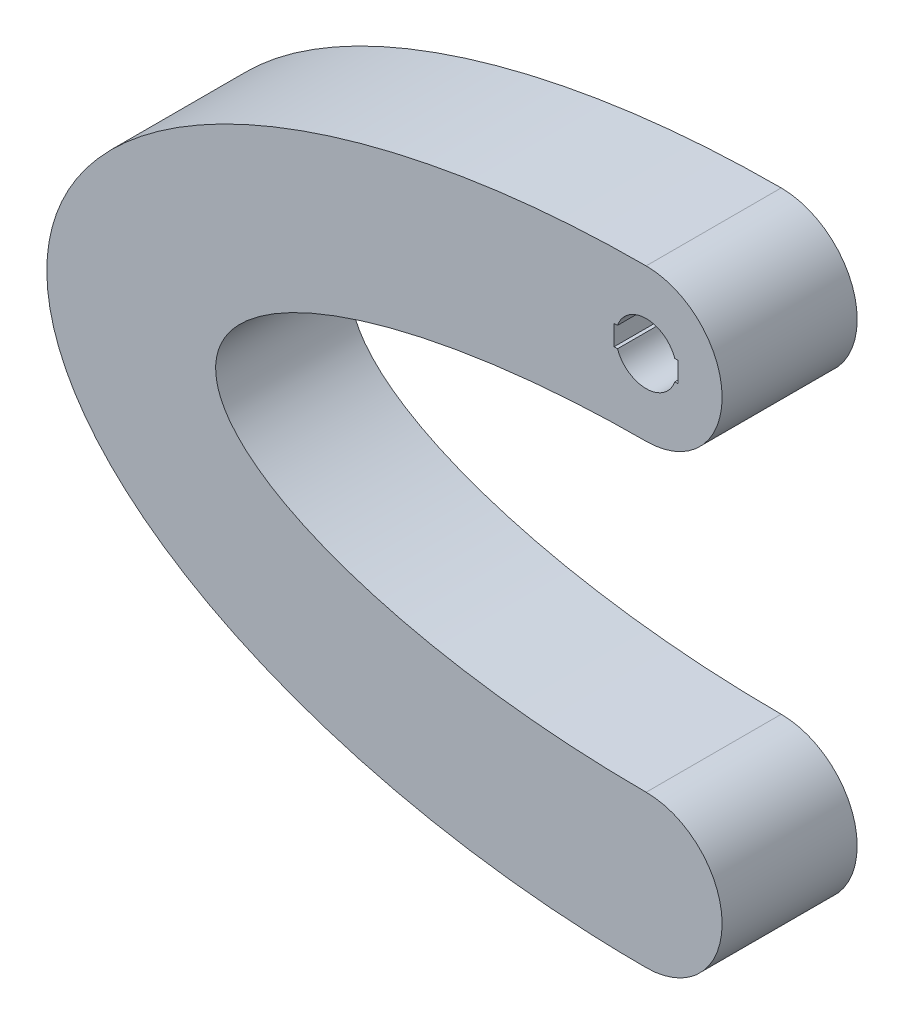
ISO-10303-21;
HEADER;
FILE_DESCRIPTION(('STEP AP214'),'2;1');
FILE_NAME('part.step','',(''),(''),'','','');
FILE_SCHEMA(('AUTOMOTIVE_DESIGN { 1 0 10303 214 1 1 1 1 }'));
ENDSEC;
DATA;
#1=APPLICATION_CONTEXT('core data for automotive mechanical design processes');
#2=APPLICATION_PROTOCOL_DEFINITION('international standard','automotive_design',2000,#1);
#3=PRODUCT_CONTEXT('',#1,'mechanical');
#4=PRODUCT('Part','Part','',(#3));
#5=PRODUCT_RELATED_PRODUCT_CATEGORY('part','',(#4));
#6=PRODUCT_DEFINITION_FORMATION('','',#4);
#7=PRODUCT_DEFINITION_CONTEXT('part definition',#1,'design');
#8=PRODUCT_DEFINITION('design','',#6,#7);
#9=PRODUCT_DEFINITION_SHAPE('','',#8);
#10=(LENGTH_UNIT() NAMED_UNIT(*) SI_UNIT(.MILLI.,.METRE.));
#11=(NAMED_UNIT(*) PLANE_ANGLE_UNIT() SI_UNIT($,.RADIAN.));
#12=(NAMED_UNIT(*) SI_UNIT($,.STERADIAN.) SOLID_ANGLE_UNIT());
#13=UNCERTAINTY_MEASURE_WITH_UNIT(LENGTH_MEASURE(1.E-05),#10,'distance_accuracy_value','');
#14=(GEOMETRIC_REPRESENTATION_CONTEXT(3) GLOBAL_UNCERTAINTY_ASSIGNED_CONTEXT((#13)) GLOBAL_UNIT_ASSIGNED_CONTEXT((#10,
#11,#12)) REPRESENTATION_CONTEXT('',''));
#15=CARTESIAN_POINT('',(0.,0.,0.));
#16=DIRECTION('',(0.,0.,1.));
#17=DIRECTION('',(1.,0.,0.));
#18=AXIS2_PLACEMENT_3D('',#15,#16,#17);
#19=CARTESIAN_POINT('',(19.375,0.,10.));
#20=DIRECTION('',(0.,0.,-1.));
#21=DIRECTION('',(-1.,0.,0.));
#22=AXIS2_PLACEMENT_3D('',#19,#20,#21);
#23=PLANE('',#22);
#24=CARTESIAN_POINT('',(19.375,0.,10.));
#25=DIRECTION('',(0.,0.,1.));
#26=DIRECTION('',(-1.,0.,0.));
#27=AXIS2_PLACEMENT_3D('',#24,#25,#26);
#28=ELLIPSE('',#27,44.375,22.5);
#29=CARTESIAN_POINT('',(19.375,22.5,10.));
#30=VERTEX_POINT('',#29);
#31=CARTESIAN_POINT('',(19.375,-22.5,10.));
#32=VERTEX_POINT('',#31);
#33=EDGE_CURVE('E348',#30,#32,#28,.T.);
#34=ORIENTED_EDGE('',*,*,#33,.T.);
#35=CARTESIAN_POINT('',(19.375,-16.875,10.));
#36=DIRECTION('',(0.,0.,1.));
#37=DIRECTION('',(1.,0.,0.));
#38=AXIS2_PLACEMENT_3D('',#35,#36,#37);
#39=CIRCLE('',#38,5.625);
#40=CARTESIAN_POINT('',(19.375,-11.25,10.));
#41=VERTEX_POINT('',#40);
#42=EDGE_CURVE('E96',#32,#41,#39,.T.);
#43=ORIENTED_EDGE('',*,*,#42,.T.);
#44=CARTESIAN_POINT('',(19.375,0.,10.));
#45=DIRECTION('',(0.,0.,-1.));
#46=DIRECTION('',(-1.,0.,0.));
#47=AXIS2_PLACEMENT_3D('',#44,#45,#46);
#48=ELLIPSE('',#47,31.875,11.25);
#49=CARTESIAN_POINT('',(19.375,11.25,10.));
#50=VERTEX_POINT('',#49);
#51=EDGE_CURVE('E354',#41,#50,#48,.T.);
#52=ORIENTED_EDGE('',*,*,#51,.T.);
#53=CARTESIAN_POINT('',(19.375,16.875,10.));
#54=DIRECTION('',(0.,0.,1.));
#55=DIRECTION('',(-1.,0.,0.));
#56=AXIS2_PLACEMENT_3D('',#53,#54,#55);
#57=CIRCLE('',#56,5.625);
#58=EDGE_CURVE('E67',#50,#30,#57,.T.);
#59=ORIENTED_EDGE('',*,*,#58,.T.);
#60=EDGE_LOOP('',(#34,#43,#52,#59));
#61=FACE_BOUND('',#60,.T.);
#62=DIRECTION('',(1.,0.,0.));
#63=VECTOR('',#62,1.);
#64=CARTESIAN_POINT('',(17.25,16.125,10.));
#65=LINE('',#64,#63);
#66=CARTESIAN_POINT('',(21.4963203435596,16.125,10.));
#67=VERTEX_POINT('',#66);
#68=CARTESIAN_POINT('',(21.75,16.125,10.));
#69=VERTEX_POINT('',#68);
#70=EDGE_CURVE('E321',#67,#69,#65,.T.);
#71=ORIENTED_EDGE('',*,*,#70,.F.);
#72=CARTESIAN_POINT('',(19.375,16.875,10.));
#73=DIRECTION('',(0.,0.,1.));
#74=DIRECTION('',(1.,0.,0.));
#75=AXIS2_PLACEMENT_3D('',#72,#73,#74);
#76=CIRCLE('',#75,2.25);
#77=CARTESIAN_POINT('',(17.2536796564404,16.125,10.));
#78=VERTEX_POINT('',#77);
#79=EDGE_CURVE('E253',#78,#67,#76,.T.);
#80=ORIENTED_EDGE('',*,*,#79,.F.);
#81=CARTESIAN_POINT('',(17.,16.125,10.));
#82=VERTEX_POINT('',#81);
#83=EDGE_CURVE('E340',#82,#78,#65,.T.);
#84=ORIENTED_EDGE('',*,*,#83,.F.);
#85=DIRECTION('',(0.,1.,0.));
#86=VECTOR('',#85,1.);
#87=CARTESIAN_POINT('',(17.,0.,10.));
#88=LINE('',#87,#86);
#89=CARTESIAN_POINT('',(17.,17.625,10.));
#90=VERTEX_POINT('',#89);
#91=EDGE_CURVE('E218',#82,#90,#88,.T.);
#92=ORIENTED_EDGE('',*,*,#91,.T.);
#93=DIRECTION('',(1.,0.,0.));
#94=VECTOR('',#93,1.);
#95=CARTESIAN_POINT('',(17.25,17.625,10.));
#96=LINE('',#95,#94);
#97=CARTESIAN_POINT('',(17.2536796564403,17.625,10.));
#98=VERTEX_POINT('',#97);
#99=EDGE_CURVE('E345',#90,#98,#96,.T.);
#100=ORIENTED_EDGE('',*,*,#99,.T.);
#101=CARTESIAN_POINT('',(19.375,16.875,10.));
#102=DIRECTION('',(0.,0.,1.));
#103=DIRECTION('',(1.,0.,0.));
#104=AXIS2_PLACEMENT_3D('',#101,#102,#103);
#105=CIRCLE('',#104,2.25);
#106=CARTESIAN_POINT('',(21.4963203435596,17.625,10.));
#107=VERTEX_POINT('',#106);
#108=EDGE_CURVE('E222',#107,#98,#105,.T.);
#109=ORIENTED_EDGE('',*,*,#108,.F.);
#110=CARTESIAN_POINT('',(21.75,17.625,10.));
#111=VERTEX_POINT('',#110);
#112=EDGE_CURVE('E344',#107,#111,#96,.T.);
#113=ORIENTED_EDGE('',*,*,#112,.T.);
#114=DIRECTION('',(0.,1.,0.));
#115=VECTOR('',#114,1.);
#116=CARTESIAN_POINT('',(21.75,0.,10.));
#117=LINE('',#116,#115);
#118=EDGE_CURVE('E256',#69,#111,#117,.T.);
#119=ORIENTED_EDGE('',*,*,#118,.F.);
#120=EDGE_LOOP('',(#71,#80,#84,#92,#100,#109,#113,#119));
#121=FACE_BOUND('',#120,.T.);
#122=ADVANCED_FACE('F41',(#61,#121),#23,.F.);
#123=CARTESIAN_POINT('',(0.,0.,2.));
#124=DIRECTION('',(0.,0.,1.));
#125=DIRECTION('',(1.,0.,0.));
#126=AXIS2_PLACEMENT_3D('',#123,#124,#125);
#127=PLANE('',#126);
#128=CARTESIAN_POINT('',(19.375,16.875,2.));
#129=DIRECTION('',(0.,0.,1.));
#130=DIRECTION('',(1.,0.,0.));
#131=AXIS2_PLACEMENT_3D('',#128,#129,#130);
#132=CIRCLE('',#131,2.25);
#133=CARTESIAN_POINT('',(17.25,16.1354900271125,2.));
#134=VERTEX_POINT('',#133);
#135=CARTESIAN_POINT('',(17.2536796564404,16.125,2.));
#136=VERTEX_POINT('',#135);
#137=EDGE_CURVE('E265',#134,#136,#132,.T.);
#138=ORIENTED_EDGE('',*,*,#137,.F.);
#139=DIRECTION('',(0.,1.,0.));
#140=VECTOR('',#139,1.);
#141=CARTESIAN_POINT('',(17.25,16.125,2.));
#142=LINE('',#141,#140);
#143=CARTESIAN_POINT('',(17.25,16.125,2.));
#144=VERTEX_POINT('',#143);
#145=EDGE_CURVE('E336',#144,#134,#142,.T.);
#146=ORIENTED_EDGE('',*,*,#145,.F.);
#147=DIRECTION('',(1.,0.,0.));
#148=VECTOR('',#147,1.);
#149=CARTESIAN_POINT('',(17.25,16.125,2.));
#150=LINE('',#149,#148);
#151=EDGE_CURVE('E322',#144,#136,#150,.T.);
#152=ORIENTED_EDGE('',*,*,#151,.T.);
#153=EDGE_LOOP('',(#138,#146,#152));
#154=FACE_BOUND('',#153,.T.);
#155=ADVANCED_FACE('F374',(#154),#127,.T.);
#156=CARTESIAN_POINT('',(21.4963203435596,16.125,2.));
#157=VERTEX_POINT('',#156);
#158=CARTESIAN_POINT('',(21.5,16.1354900271126,2.));
#159=VERTEX_POINT('',#158);
#160=EDGE_CURVE('E199',#157,#159,#132,.T.);
#161=ORIENTED_EDGE('',*,*,#160,.F.);
#162=CARTESIAN_POINT('',(21.5,16.125,2.));
#163=VERTEX_POINT('',#162);
#164=EDGE_CURVE('E327',#157,#163,#150,.T.);
#165=ORIENTED_EDGE('',*,*,#164,.T.);
#166=DIRECTION('',(0.,1.,0.));
#167=VECTOR('',#166,1.);
#168=CARTESIAN_POINT('',(21.5,16.125,2.));
#169=LINE('',#168,#167);
#170=EDGE_CURVE('E328',#163,#159,#169,.T.);
#171=ORIENTED_EDGE('',*,*,#170,.T.);
#172=EDGE_LOOP('',(#161,#165,#171));
#173=FACE_BOUND('',#172,.T.);
#174=ADVANCED_FACE('F380',(#173),#127,.T.);
#175=CARTESIAN_POINT('',(19.375,16.875,2.));
#176=DIRECTION('',(0.,0.,1.));
#177=DIRECTION('',(1.,0.,0.));
#178=AXIS2_PLACEMENT_3D('',#175,#176,#177);
#179=CIRCLE('',#178,2.25);
#180=CARTESIAN_POINT('',(21.5,17.6145099728874,2.));
#181=VERTEX_POINT('',#180);
#182=CARTESIAN_POINT('',(21.4963203435596,17.625,2.));
#183=VERTEX_POINT('',#182);
#184=EDGE_CURVE('E311',#181,#183,#179,.T.);
#185=ORIENTED_EDGE('',*,*,#184,.F.);
#186=CARTESIAN_POINT('',(21.5,17.625,2.));
#187=VERTEX_POINT('',#186);
#188=EDGE_CURVE('E326',#181,#187,#169,.T.);
#189=ORIENTED_EDGE('',*,*,#188,.T.);
#190=DIRECTION('',(1.,0.,0.));
#191=VECTOR('',#190,1.);
#192=CARTESIAN_POINT('',(17.25,17.625,2.));
#193=LINE('',#192,#191);
#194=EDGE_CURVE('E331',#183,#187,#193,.T.);
#195=ORIENTED_EDGE('',*,*,#194,.F.);
#196=EDGE_LOOP('',(#185,#189,#195));
#197=FACE_BOUND('',#196,.T.);
#198=ADVANCED_FACE('F371',(#197),#127,.T.);
#199=DIRECTION('',(0.,0.,-1.));
#200=VECTOR('',#199,1.);
#201=SURFACE_OF_LINEAR_EXTRUSION('',#28,#200);
#202=CARTESIAN_POINT('',(19.375,0.,0.));
#203=DIRECTION('',(0.,0.,1.));
#204=DIRECTION('',(-1.,0.,0.));
#205=AXIS2_PLACEMENT_3D('',#202,#203,#204);
#206=ELLIPSE('',#205,44.375,22.5);
#207=CARTESIAN_POINT('',(19.375,22.5,0.));
#208=VERTEX_POINT('',#207);
#209=CARTESIAN_POINT('',(19.375,-22.5,0.));
#210=VERTEX_POINT('',#209);
#211=EDGE_CURVE('E339',#208,#210,#206,.T.);
#212=ORIENTED_EDGE('',*,*,#211,.T.);
#213=DIRECTION('',(0.,0.,-1.));
#214=VECTOR('',#213,1.);
#215=CARTESIAN_POINT('',(19.375,-22.5,10.));
#216=LINE('',#215,#214);
#217=EDGE_CURVE('E51',#32,#210,#216,.T.);
#218=ORIENTED_EDGE('',*,*,#217,.F.);
#219=ORIENTED_EDGE('',*,*,#33,.F.);
#220=DIRECTION('',(0.,0.,-1.));
#221=VECTOR('',#220,1.);
#222=CARTESIAN_POINT('',(19.375,22.5,10.));
#223=LINE('',#222,#221);
#224=EDGE_CURVE('E616',#30,#208,#223,.T.);
#225=ORIENTED_EDGE('',*,*,#224,.T.);
#226=EDGE_LOOP('',(#212,#218,#219,#225));
#227=FACE_BOUND('',#226,.T.);
#228=ADVANCED_FACE('F43',(#227),#201,.F.);
#229=CARTESIAN_POINT('',(19.375,-16.875,10.));
#230=DIRECTION('',(0.,0.,-1.));
#231=DIRECTION('',(-1.,0.,0.));
#232=AXIS2_PLACEMENT_3D('',#229,#230,#231);
#233=CYLINDRICAL_SURFACE('',#232,5.625);
#234=CARTESIAN_POINT('',(19.375,-16.875,0.));
#235=DIRECTION('',(0.,0.,1.));
#236=DIRECTION('',(1.,0.,0.));
#237=AXIS2_PLACEMENT_3D('',#234,#235,#236);
#238=CIRCLE('',#237,5.625);
#239=CARTESIAN_POINT('',(19.375,-11.25,0.));
#240=VERTEX_POINT('',#239);
#241=EDGE_CURVE('E607',#210,#240,#238,.T.);
#242=ORIENTED_EDGE('',*,*,#241,.T.);
#243=DIRECTION('',(0.,0.,-1.));
#244=VECTOR('',#243,1.);
#245=CARTESIAN_POINT('',(19.375,-11.25,10.));
#246=LINE('',#245,#244);
#247=EDGE_CURVE('E621',#41,#240,#246,.T.);
#248=ORIENTED_EDGE('',*,*,#247,.F.);
#249=ORIENTED_EDGE('',*,*,#42,.F.);
#250=ORIENTED_EDGE('',*,*,#217,.T.);
#251=EDGE_LOOP('',(#242,#248,#249,#250));
#252=FACE_BOUND('',#251,.T.);
#253=ADVANCED_FACE('F364',(#252),#233,.T.);
#254=DIRECTION('',(0.,0.,-1.));
#255=VECTOR('',#254,1.);
#256=SURFACE_OF_LINEAR_EXTRUSION('',#48,#255);
#257=CARTESIAN_POINT('',(19.375,0.,0.));
#258=DIRECTION('',(0.,0.,-1.));
#259=DIRECTION('',(-1.,0.,0.));
#260=AXIS2_PLACEMENT_3D('',#257,#258,#259);
#261=ELLIPSE('',#260,31.875,11.25);
#262=CARTESIAN_POINT('',(19.375,11.25,0.));
#263=VERTEX_POINT('',#262);
#264=EDGE_CURVE('E609',#240,#263,#261,.T.);
#265=ORIENTED_EDGE('',*,*,#264,.T.);
#266=DIRECTION('',(0.,0.,-1.));
#267=VECTOR('',#266,1.);
#268=CARTESIAN_POINT('',(19.375,11.25,10.));
#269=LINE('',#268,#267);
#270=EDGE_CURVE('E618',#50,#263,#269,.T.);
#271=ORIENTED_EDGE('',*,*,#270,.F.);
#272=ORIENTED_EDGE('',*,*,#51,.F.);
#273=ORIENTED_EDGE('',*,*,#247,.T.);
#274=EDGE_LOOP('',(#265,#271,#272,#273));
#275=FACE_BOUND('',#274,.T.);
#276=ADVANCED_FACE('F360',(#275),#256,.F.);
#277=CARTESIAN_POINT('',(19.375,16.875,10.));
#278=DIRECTION('',(0.,0.,-1.));
#279=DIRECTION('',(-1.,0.,0.));
#280=AXIS2_PLACEMENT_3D('',#277,#278,#279);
#281=CYLINDRICAL_SURFACE('',#280,5.625);
#282=CARTESIAN_POINT('',(19.375,16.875,0.));
#283=DIRECTION('',(0.,0.,1.));
#284=DIRECTION('',(-1.,0.,0.));
#285=AXIS2_PLACEMENT_3D('',#282,#283,#284);
#286=CIRCLE('',#285,5.625);
#287=EDGE_CURVE('E88',#263,#208,#286,.T.);
#288=ORIENTED_EDGE('',*,*,#287,.T.);
#289=ORIENTED_EDGE('',*,*,#224,.F.);
#290=ORIENTED_EDGE('',*,*,#58,.F.);
#291=ORIENTED_EDGE('',*,*,#270,.T.);
#292=EDGE_LOOP('',(#288,#289,#290,#291));
#293=FACE_BOUND('',#292,.T.);
#294=ADVANCED_FACE('F363',(#293),#281,.T.);
#295=CARTESIAN_POINT('',(19.375,0.,0.));
#296=DIRECTION('',(0.,0.,-1.));
#297=DIRECTION('',(-1.,0.,0.));
#298=AXIS2_PLACEMENT_3D('',#295,#296,#297);
#299=PLANE('',#298);
#300=CARTESIAN_POINT('',(19.375,16.875,0.));
#301=DIRECTION('',(0.,0.,1.));
#302=DIRECTION('',(1.,0.,0.));
#303=AXIS2_PLACEMENT_3D('',#300,#301,#302);
#304=CIRCLE('',#303,2.25);
#305=CARTESIAN_POINT('',(17.25,16.1354900271125,0.));
#306=VERTEX_POINT('',#305);
#307=CARTESIAN_POINT('',(21.5,16.1354900271126,0.));
#308=VERTEX_POINT('',#307);
#309=EDGE_CURVE('E196',#306,#308,#304,.T.);
#310=ORIENTED_EDGE('',*,*,#309,.T.);
#311=DIRECTION('',(0.,-1.,0.));
#312=VECTOR('',#311,1.);
#313=CARTESIAN_POINT('',(21.5,0.,0.));
#314=LINE('',#313,#312);
#315=CARTESIAN_POINT('',(21.5,16.125,0.));
#316=VERTEX_POINT('',#315);
#317=EDGE_CURVE('E207',#308,#316,#314,.T.);
#318=ORIENTED_EDGE('',*,*,#317,.T.);
#319=DIRECTION('',(1.,0.,0.));
#320=VECTOR('',#319,1.);
#321=CARTESIAN_POINT('',(0.,16.125,0.));
#322=LINE('',#321,#320);
#323=CARTESIAN_POINT('',(21.75,16.125,0.));
#324=VERTEX_POINT('',#323);
#325=EDGE_CURVE('E58',#316,#324,#322,.T.);
#326=ORIENTED_EDGE('',*,*,#325,.T.);
#327=DIRECTION('',(0.,1.,0.));
#328=VECTOR('',#327,1.);
#329=CARTESIAN_POINT('',(21.75,0.,0.));
#330=LINE('',#329,#328);
#331=CARTESIAN_POINT('',(21.75,17.625,0.));
#332=VERTEX_POINT('',#331);
#333=EDGE_CURVE('E227',#324,#332,#330,.T.);
#334=ORIENTED_EDGE('',*,*,#333,.T.);
#335=DIRECTION('',(-1.,0.,0.));
#336=VECTOR('',#335,1.);
#337=CARTESIAN_POINT('',(0.,17.625,0.));
#338=LINE('',#337,#336);
#339=CARTESIAN_POINT('',(21.5,17.625,0.));
#340=VERTEX_POINT('',#339);
#341=EDGE_CURVE('E231',#332,#340,#338,.T.);
#342=ORIENTED_EDGE('',*,*,#341,.T.);
#343=CARTESIAN_POINT('',(21.5,17.6145099728874,0.));
#344=VERTEX_POINT('',#343);
#345=EDGE_CURVE('E212',#340,#344,#314,.T.);
#346=ORIENTED_EDGE('',*,*,#345,.T.);
#347=CARTESIAN_POINT('',(19.375,16.875,0.));
#348=DIRECTION('',(0.,0.,1.));
#349=DIRECTION('',(1.,0.,0.));
#350=AXIS2_PLACEMENT_3D('',#347,#348,#349);
#351=CIRCLE('',#350,2.25);
#352=CARTESIAN_POINT('',(17.25,17.6145099728875,0.));
#353=VERTEX_POINT('',#352);
#354=EDGE_CURVE('E235',#344,#353,#351,.T.);
#355=ORIENTED_EDGE('',*,*,#354,.T.);
#356=DIRECTION('',(0.,1.,0.));
#357=VECTOR('',#356,1.);
#358=CARTESIAN_POINT('',(17.25,0.,0.));
#359=LINE('',#358,#357);
#360=CARTESIAN_POINT('',(17.25,17.625,0.));
#361=VERTEX_POINT('',#360);
#362=EDGE_CURVE('E239',#353,#361,#359,.T.);
#363=ORIENTED_EDGE('',*,*,#362,.T.);
#364=DIRECTION('',(-1.,0.,0.));
#365=VECTOR('',#364,1.);
#366=CARTESIAN_POINT('',(0.,17.625,0.));
#367=LINE('',#366,#365);
#368=CARTESIAN_POINT('',(17.,17.625,0.));
#369=VERTEX_POINT('',#368);
#370=EDGE_CURVE('E243',#361,#369,#367,.T.);
#371=ORIENTED_EDGE('',*,*,#370,.T.);
#372=DIRECTION('',(0.,1.,0.));
#373=VECTOR('',#372,1.);
#374=CARTESIAN_POINT('',(17.,0.,0.));
#375=LINE('',#374,#373);
#376=CARTESIAN_POINT('',(17.,16.125,0.));
#377=VERTEX_POINT('',#376);
#378=EDGE_CURVE('E247',#377,#369,#375,.T.);
#379=ORIENTED_EDGE('',*,*,#378,.F.);
#380=DIRECTION('',(-1.,0.,0.));
#381=VECTOR('',#380,1.);
#382=CARTESIAN_POINT('',(0.,16.125,0.));
#383=LINE('',#382,#381);
#384=CARTESIAN_POINT('',(17.25,16.125,0.));
#385=VERTEX_POINT('',#384);
#386=EDGE_CURVE('E250',#385,#377,#383,.T.);
#387=ORIENTED_EDGE('',*,*,#386,.F.);
#388=EDGE_CURVE('E204',#385,#306,#359,.T.);
#389=ORIENTED_EDGE('',*,*,#388,.T.);
#390=EDGE_LOOP('',(#310,#318,#326,#334,#342,#346,#355,#363,#371,#379,#387,#389));
#391=FACE_BOUND('',#390,.T.);
#392=ORIENTED_EDGE('',*,*,#211,.F.);
#393=ORIENTED_EDGE('',*,*,#287,.F.);
#394=ORIENTED_EDGE('',*,*,#264,.F.);
#395=ORIENTED_EDGE('',*,*,#241,.F.);
#396=EDGE_LOOP('',(#392,#393,#394,#395));
#397=FACE_BOUND('',#396,.T.);
#398=ADVANCED_FACE('F213',(#391,#397),#299,.T.);
#399=CARTESIAN_POINT('',(17.2536796564403,17.625,2.));
#400=VERTEX_POINT('',#399);
#401=CARTESIAN_POINT('',(17.25,17.6145099728875,2.));
#402=VERTEX_POINT('',#401);
#403=EDGE_CURVE('E315',#400,#402,#179,.T.);
#404=ORIENTED_EDGE('',*,*,#403,.F.);
#405=CARTESIAN_POINT('',(17.25,17.625,2.));
#406=VERTEX_POINT('',#405);
#407=EDGE_CURVE('E332',#406,#400,#193,.T.);
#408=ORIENTED_EDGE('',*,*,#407,.F.);
#409=DIRECTION('',(0.,1.,0.));
#410=VECTOR('',#409,1.);
#411=CARTESIAN_POINT('',(17.25,0.,2.));
#412=LINE('',#411,#410);
#413=EDGE_CURVE('E318',#402,#406,#412,.T.);
#414=ORIENTED_EDGE('',*,*,#413,.F.);
#415=EDGE_LOOP('',(#404,#408,#414));
#416=FACE_BOUND('',#415,.T.);
#417=ADVANCED_FACE('F383',(#416),#127,.T.);
#418=CARTESIAN_POINT('',(17.25,17.625,2.));
#419=DIRECTION('',(0.,-1.,0.));
#420=DIRECTION('',(0.,0.,-1.));
#421=AXIS2_PLACEMENT_3D('',#418,#419,#420);
#422=PLANE('',#421);
#423=DIRECTION('',(0.,0.,1.));
#424=VECTOR('',#423,1.);
#425=CARTESIAN_POINT('',(17.2536796564403,17.625,0.));
#426=LINE('',#425,#424);
#427=EDGE_CURVE('E314',#98,#400,#426,.F.);
#428=ORIENTED_EDGE('',*,*,#427,.F.);
#429=ORIENTED_EDGE('',*,*,#99,.F.);
#430=DIRECTION('',(0.,0.,1.));
#431=VECTOR('',#430,1.);
#432=CARTESIAN_POINT('',(17.,17.625,0.));
#433=LINE('',#432,#431);
#434=EDGE_CURVE('E273',#369,#90,#433,.T.);
#435=ORIENTED_EDGE('',*,*,#434,.F.);
#436=ORIENTED_EDGE('',*,*,#370,.F.);
#437=DIRECTION('',(0.,0.,1.));
#438=VECTOR('',#437,1.);
#439=CARTESIAN_POINT('',(17.25,17.625,0.));
#440=LINE('',#439,#438);
#441=EDGE_CURVE('E277',#361,#406,#440,.T.);
#442=ORIENTED_EDGE('',*,*,#441,.T.);
#443=ORIENTED_EDGE('',*,*,#407,.T.);
#444=EDGE_LOOP('',(#428,#429,#435,#436,#442,#443));
#445=FACE_BOUND('',#444,.T.);
#446=ADVANCED_FACE('F393',(#445),#422,.T.);
#447=DIRECTION('',(0.,0.,1.));
#448=VECTOR('',#447,1.);
#449=CARTESIAN_POINT('',(21.4963203435596,17.625,0.));
#450=LINE('',#449,#448);
#451=EDGE_CURVE('E308',#183,#107,#450,.T.);
#452=ORIENTED_EDGE('',*,*,#451,.F.);
#453=ORIENTED_EDGE('',*,*,#194,.T.);
#454=DIRECTION('',(0.,0.,1.));
#455=VECTOR('',#454,1.);
#456=CARTESIAN_POINT('',(21.5,17.625,0.));
#457=LINE('',#456,#455);
#458=EDGE_CURVE('E289',#340,#187,#457,.T.);
#459=ORIENTED_EDGE('',*,*,#458,.F.);
#460=ORIENTED_EDGE('',*,*,#341,.F.);
#461=DIRECTION('',(0.,0.,1.));
#462=VECTOR('',#461,1.);
#463=CARTESIAN_POINT('',(21.75,17.625,0.));
#464=LINE('',#463,#462);
#465=EDGE_CURVE('E292',#332,#111,#464,.T.);
#466=ORIENTED_EDGE('',*,*,#465,.T.);
#467=ORIENTED_EDGE('',*,*,#112,.F.);
#468=EDGE_LOOP('',(#452,#453,#459,#460,#466,#467));
#469=FACE_BOUND('',#468,.T.);
#470=ADVANCED_FACE('F395',(#469),#422,.T.);
#471=CARTESIAN_POINT('',(17.25,16.125,2.));
#472=DIRECTION('',(0.,-1.,0.));
#473=DIRECTION('',(0.,0.,-1.));
#474=AXIS2_PLACEMENT_3D('',#471,#472,#473);
#475=PLANE('',#474);
#476=ORIENTED_EDGE('',*,*,#164,.F.);
#477=DIRECTION('',(0.,0.,1.));
#478=VECTOR('',#477,1.);
#479=CARTESIAN_POINT('',(21.4963203435596,16.125,0.));
#480=LINE('',#479,#478);
#481=EDGE_CURVE('E304',#157,#67,#480,.T.);
#482=ORIENTED_EDGE('',*,*,#481,.T.);
#483=ORIENTED_EDGE('',*,*,#70,.T.);
#484=DIRECTION('',(0.,0.,1.));
#485=VECTOR('',#484,1.);
#486=CARTESIAN_POINT('',(21.75,16.125,0.));
#487=LINE('',#486,#485);
#488=EDGE_CURVE('E296',#324,#69,#487,.T.);
#489=ORIENTED_EDGE('',*,*,#488,.F.);
#490=ORIENTED_EDGE('',*,*,#325,.F.);
#491=DIRECTION('',(0.,0.,1.));
#492=VECTOR('',#491,1.);
#493=CARTESIAN_POINT('',(21.5,16.125,0.));
#494=LINE('',#493,#492);
#495=EDGE_CURVE('E203',#316,#163,#494,.T.);
#496=ORIENTED_EDGE('',*,*,#495,.T.);
#497=EDGE_LOOP('',(#476,#482,#483,#489,#490,#496));
#498=FACE_BOUND('',#497,.T.);
#499=ADVANCED_FACE('F451',(#498),#475,.F.);
#500=ORIENTED_EDGE('',*,*,#83,.T.);
#501=DIRECTION('',(0.,0.,1.));
#502=VECTOR('',#501,1.);
#503=CARTESIAN_POINT('',(17.2536796564404,16.125,0.));
#504=LINE('',#503,#502);
#505=EDGE_CURVE('E12',#78,#136,#504,.F.);
#506=ORIENTED_EDGE('',*,*,#505,.T.);
#507=ORIENTED_EDGE('',*,*,#151,.F.);
#508=DIRECTION('',(0.,0.,1.));
#509=VECTOR('',#508,1.);
#510=CARTESIAN_POINT('',(17.25,16.125,0.));
#511=LINE('',#510,#509);
#512=EDGE_CURVE('E266',#385,#144,#511,.T.);
#513=ORIENTED_EDGE('',*,*,#512,.F.);
#514=ORIENTED_EDGE('',*,*,#386,.T.);
#515=DIRECTION('',(0.,0.,1.));
#516=VECTOR('',#515,1.);
#517=CARTESIAN_POINT('',(17.,16.125,0.));
#518=LINE('',#517,#516);
#519=EDGE_CURVE('E269',#377,#82,#518,.T.);
#520=ORIENTED_EDGE('',*,*,#519,.T.);
#521=EDGE_LOOP('',(#500,#506,#507,#513,#514,#520));
#522=FACE_BOUND('',#521,.T.);
#523=ADVANCED_FACE('F386',(#522),#475,.F.);
#524=CARTESIAN_POINT('',(19.375,16.875,0.));
#525=DIRECTION('',(0.,0.,1.));
#526=DIRECTION('',(1.,0.,0.));
#527=AXIS2_PLACEMENT_3D('',#524,#525,#526);
#528=CYLINDRICAL_SURFACE('',#527,2.25);
#529=ORIENTED_EDGE('',*,*,#160,.T.);
#530=DIRECTION('',(0.,0.,1.));
#531=VECTOR('',#530,1.);
#532=CARTESIAN_POINT('',(21.5,16.1354900271126,0.));
#533=LINE('',#532,#531);
#534=EDGE_CURVE('E191',#308,#159,#533,.T.);
#535=ORIENTED_EDGE('',*,*,#534,.F.);
#536=ORIENTED_EDGE('',*,*,#309,.F.);
#537=DIRECTION('',(0.,0.,1.));
#538=VECTOR('',#537,1.);
#539=CARTESIAN_POINT('',(17.25,16.1354900271125,0.));
#540=LINE('',#539,#538);
#541=EDGE_CURVE('E262',#306,#134,#540,.T.);
#542=ORIENTED_EDGE('',*,*,#541,.T.);
#543=ORIENTED_EDGE('',*,*,#137,.T.);
#544=ORIENTED_EDGE('',*,*,#505,.F.);
#545=ORIENTED_EDGE('',*,*,#79,.T.);
#546=ORIENTED_EDGE('',*,*,#481,.F.);
#547=EDGE_LOOP('',(#529,#535,#536,#542,#543,#544,#545,#546));
#548=FACE_BOUND('',#547,.T.);
#549=ADVANCED_FACE('F193',(#548),#528,.F.);
#550=CARTESIAN_POINT('',(17.25,0.,0.));
#551=DIRECTION('',(1.,0.,0.));
#552=DIRECTION('',(0.,0.,-1.));
#553=AXIS2_PLACEMENT_3D('',#550,#551,#552);
#554=PLANE('',#553);
#555=ORIENTED_EDGE('',*,*,#145,.T.);
#556=ORIENTED_EDGE('',*,*,#541,.F.);
#557=ORIENTED_EDGE('',*,*,#388,.F.);
#558=ORIENTED_EDGE('',*,*,#512,.T.);
#559=EDGE_LOOP('',(#555,#556,#557,#558));
#560=FACE_BOUND('',#559,.T.);
#561=ADVANCED_FACE('F469',(#560),#554,.F.);
#562=CARTESIAN_POINT('',(17.,0.,0.));
#563=DIRECTION('',(1.,0.,0.));
#564=DIRECTION('',(0.,0.,-1.));
#565=AXIS2_PLACEMENT_3D('',#562,#563,#564);
#566=PLANE('',#565);
#567=ORIENTED_EDGE('',*,*,#91,.F.);
#568=ORIENTED_EDGE('',*,*,#519,.F.);
#569=ORIENTED_EDGE('',*,*,#378,.T.);
#570=ORIENTED_EDGE('',*,*,#434,.T.);
#571=EDGE_LOOP('',(#567,#568,#569,#570));
#572=FACE_BOUND('',#571,.T.);
#573=ADVANCED_FACE('F476',(#572),#566,.T.);
#574=ORIENTED_EDGE('',*,*,#413,.T.);
#575=ORIENTED_EDGE('',*,*,#441,.F.);
#576=ORIENTED_EDGE('',*,*,#362,.F.);
#577=DIRECTION('',(0.,0.,1.));
#578=VECTOR('',#577,1.);
#579=CARTESIAN_POINT('',(17.25,17.6145099728875,0.));
#580=LINE('',#579,#578);
#581=EDGE_CURVE('E281',#353,#402,#580,.T.);
#582=ORIENTED_EDGE('',*,*,#581,.T.);
#583=EDGE_LOOP('',(#574,#575,#576,#582));
#584=FACE_BOUND('',#583,.T.);
#585=ADVANCED_FACE('F479',(#584),#554,.F.);
#586=CARTESIAN_POINT('',(19.375,16.875,0.));
#587=DIRECTION('',(0.,0.,1.));
#588=DIRECTION('',(1.,0.,0.));
#589=AXIS2_PLACEMENT_3D('',#586,#587,#588);
#590=CYLINDRICAL_SURFACE('',#589,2.25);
#591=ORIENTED_EDGE('',*,*,#403,.T.);
#592=ORIENTED_EDGE('',*,*,#581,.F.);
#593=ORIENTED_EDGE('',*,*,#354,.F.);
#594=DIRECTION('',(0.,0.,1.));
#595=VECTOR('',#594,1.);
#596=CARTESIAN_POINT('',(21.5,17.6145099728874,0.));
#597=LINE('',#596,#595);
#598=EDGE_CURVE('E285',#344,#181,#597,.T.);
#599=ORIENTED_EDGE('',*,*,#598,.T.);
#600=ORIENTED_EDGE('',*,*,#184,.T.);
#601=ORIENTED_EDGE('',*,*,#451,.T.);
#602=ORIENTED_EDGE('',*,*,#108,.T.);
#603=ORIENTED_EDGE('',*,*,#427,.T.);
#604=EDGE_LOOP('',(#591,#592,#593,#599,#600,#601,#602,#603));
#605=FACE_BOUND('',#604,.T.);
#606=ADVANCED_FACE('F492',(#605),#590,.F.);
#607=CARTESIAN_POINT('',(21.5,0.,0.));
#608=DIRECTION('',(-1.,0.,0.));
#609=DIRECTION('',(0.,0.,1.));
#610=AXIS2_PLACEMENT_3D('',#607,#608,#609);
#611=PLANE('',#610);
#612=ORIENTED_EDGE('',*,*,#188,.F.);
#613=ORIENTED_EDGE('',*,*,#598,.F.);
#614=ORIENTED_EDGE('',*,*,#345,.F.);
#615=ORIENTED_EDGE('',*,*,#458,.T.);
#616=EDGE_LOOP('',(#612,#613,#614,#615));
#617=FACE_BOUND('',#616,.T.);
#618=ADVANCED_FACE('F499',(#617),#611,.F.);
#619=CARTESIAN_POINT('',(21.75,0.,0.));
#620=DIRECTION('',(1.,0.,0.));
#621=DIRECTION('',(0.,0.,-1.));
#622=AXIS2_PLACEMENT_3D('',#619,#620,#621);
#623=PLANE('',#622);
#624=ORIENTED_EDGE('',*,*,#118,.T.);
#625=ORIENTED_EDGE('',*,*,#465,.F.);
#626=ORIENTED_EDGE('',*,*,#333,.F.);
#627=ORIENTED_EDGE('',*,*,#488,.T.);
#628=EDGE_LOOP('',(#624,#625,#626,#627));
#629=FACE_BOUND('',#628,.T.);
#630=ADVANCED_FACE('F507',(#629),#623,.F.);
#631=ORIENTED_EDGE('',*,*,#170,.F.);
#632=ORIENTED_EDGE('',*,*,#495,.F.);
#633=ORIENTED_EDGE('',*,*,#317,.F.);
#634=ORIENTED_EDGE('',*,*,#534,.T.);
#635=EDGE_LOOP('',(#631,#632,#633,#634));
#636=FACE_BOUND('',#635,.T.);
#637=ADVANCED_FACE('F208',(#636),#611,.F.);
#638=CLOSED_SHELL('',(#122,#155,#174,#198,#228,#253,#276,#294,#398,#417,#446,#470,#499,#523,
#549,#561,#573,#585,#606,#618,#630,#637));
#639=MANIFOLD_SOLID_BREP('B2',#638);
#640=ADVANCED_BREP_SHAPE_REPRESENTATION('',(#18,#639),#14);
#641=SHAPE_DEFINITION_REPRESENTATION(#9,#640);
ENDSEC;
END-ISO-10303-21;
